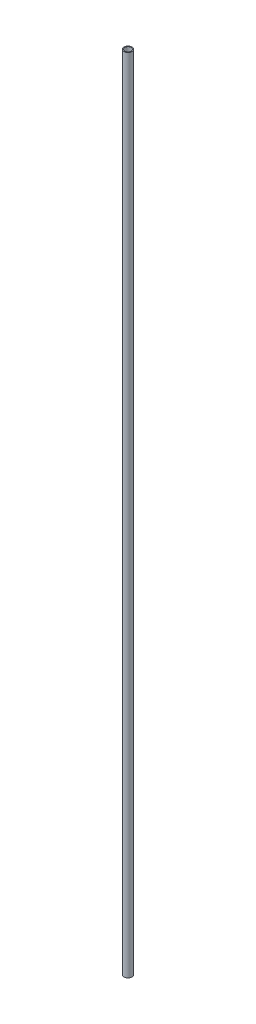
ISO-10303-21;
HEADER;
FILE_DESCRIPTION(('STEP AP214'),'2;1');
FILE_NAME('part.step','',(''),(''),'','','');
FILE_SCHEMA(('AUTOMOTIVE_DESIGN { 1 0 10303 214 1 1 1 1 }'));
ENDSEC;
DATA;
#1=APPLICATION_CONTEXT('core data for automotive mechanical design processes');
#2=APPLICATION_PROTOCOL_DEFINITION('international standard','automotive_design',2000,#1);
#3=PRODUCT_CONTEXT('',#1,'mechanical');
#4=PRODUCT('Part','Part','',(#3));
#5=PRODUCT_RELATED_PRODUCT_CATEGORY('part','',(#4));
#6=PRODUCT_DEFINITION_FORMATION('','',#4);
#7=PRODUCT_DEFINITION_CONTEXT('part definition',#1,'design');
#8=PRODUCT_DEFINITION('design','',#6,#7);
#9=PRODUCT_DEFINITION_SHAPE('','',#8);
#10=(LENGTH_UNIT() NAMED_UNIT(*) SI_UNIT(.MILLI.,.METRE.));
#11=(NAMED_UNIT(*) PLANE_ANGLE_UNIT() SI_UNIT($,.RADIAN.));
#12=(NAMED_UNIT(*) SI_UNIT($,.STERADIAN.) SOLID_ANGLE_UNIT());
#13=UNCERTAINTY_MEASURE_WITH_UNIT(LENGTH_MEASURE(1.E-05),#10,'distance_accuracy_value','');
#14=(GEOMETRIC_REPRESENTATION_CONTEXT(3) GLOBAL_UNCERTAINTY_ASSIGNED_CONTEXT((#13)) GLOBAL_UNIT_ASSIGNED_CONTEXT((#10,
#11,#12)) REPRESENTATION_CONTEXT('',''));
#15=CARTESIAN_POINT('',(0.,0.,0.));
#16=DIRECTION('',(0.,0.,1.));
#17=DIRECTION('',(1.,0.,0.));
#18=AXIS2_PLACEMENT_3D('',#15,#16,#17);
#19=CARTESIAN_POINT('',(0.,-1000.,0.));
#20=DIRECTION('',(0.,1.,0.));
#21=DIRECTION('',(0.,0.,1.));
#22=AXIS2_PLACEMENT_3D('',#19,#20,#21);
#23=CYLINDRICAL_SURFACE('',#22,5.);
#24=CARTESIAN_POINT('',(0.,-1000.,0.));
#25=DIRECTION('',(0.,1.,0.));
#26=DIRECTION('',(0.,0.,1.));
#27=AXIS2_PLACEMENT_3D('',#24,#25,#26);
#28=CIRCLE('',#27,5.);
#29=CARTESIAN_POINT('',(0.,-1000.,5.00000000000008));
#30=VERTEX_POINT('',#29);
#31=EDGE_CURVE('E12',#30,#30,#28,.T.);
#32=ORIENTED_EDGE('',*,*,#31,.T.);
#33=EDGE_LOOP('',(#32));
#34=FACE_BOUND('',#33,.T.);
#35=CARTESIAN_POINT('',(0.,0.,0.));
#36=DIRECTION('',(0.,1.,0.));
#37=DIRECTION('',(0.,0.,1.));
#38=AXIS2_PLACEMENT_3D('',#35,#36,#37);
#39=CIRCLE('',#38,5.);
#40=CARTESIAN_POINT('',(0.,0.,5.));
#41=VERTEX_POINT('',#40);
#42=EDGE_CURVE('E56',#41,#41,#39,.T.);
#43=ORIENTED_EDGE('',*,*,#42,.F.);
#44=EDGE_LOOP('',(#43));
#45=FACE_BOUND('',#44,.T.);
#46=ADVANCED_FACE('F53',(#34,#45),#23,.T.);
#47=CARTESIAN_POINT('',(0.,-1000.,0.));
#48=DIRECTION('',(0.,1.,0.));
#49=DIRECTION('',(0.,0.,1.));
#50=AXIS2_PLACEMENT_3D('',#47,#48,#49);
#51=PLANE('',#50);
#52=CARTESIAN_POINT('',(0.,-1000.,0.));
#53=DIRECTION('',(0.,1.,0.));
#54=DIRECTION('',(0.,0.,1.));
#55=AXIS2_PLACEMENT_3D('',#52,#53,#54);
#56=CIRCLE('',#55,4.);
#57=CARTESIAN_POINT('',(0.,-1000.,4.00000000000008));
#58=VERTEX_POINT('',#57);
#59=EDGE_CURVE('E63',#58,#58,#56,.T.);
#60=ORIENTED_EDGE('',*,*,#59,.T.);
#61=EDGE_LOOP('',(#60));
#62=FACE_BOUND('',#61,.T.);
#63=ORIENTED_EDGE('',*,*,#31,.F.);
#64=EDGE_LOOP('',(#63));
#65=FACE_BOUND('',#64,.T.);
#66=ADVANCED_FACE('F71',(#62,#65),#51,.F.);
#67=CARTESIAN_POINT('',(0.,0.,0.));
#68=DIRECTION('',(0.,1.,0.));
#69=DIRECTION('',(0.,0.,1.));
#70=AXIS2_PLACEMENT_3D('',#67,#68,#69);
#71=PLANE('',#70);
#72=CARTESIAN_POINT('',(0.,0.,0.));
#73=DIRECTION('',(0.,1.,0.));
#74=DIRECTION('',(0.,0.,1.));
#75=AXIS2_PLACEMENT_3D('',#72,#73,#74);
#76=CIRCLE('',#75,4.);
#77=CARTESIAN_POINT('',(0.,0.,4.));
#78=VERTEX_POINT('',#77);
#79=EDGE_CURVE('E65',#78,#78,#76,.T.);
#80=ORIENTED_EDGE('',*,*,#79,.F.);
#81=EDGE_LOOP('',(#80));
#82=FACE_BOUND('',#81,.T.);
#83=ORIENTED_EDGE('',*,*,#42,.T.);
#84=EDGE_LOOP('',(#83));
#85=FACE_BOUND('',#84,.T.);
#86=ADVANCED_FACE('F77',(#82,#85),#71,.T.);
#87=CARTESIAN_POINT('',(0.,-1000.,0.));
#88=DIRECTION('',(0.,1.,0.));
#89=DIRECTION('',(0.,0.,1.));
#90=AXIS2_PLACEMENT_3D('',#87,#88,#89);
#91=CYLINDRICAL_SURFACE('',#90,4.);
#92=ORIENTED_EDGE('',*,*,#59,.F.);
#93=EDGE_LOOP('',(#92));
#94=FACE_BOUND('',#93,.T.);
#95=ORIENTED_EDGE('',*,*,#79,.T.);
#96=EDGE_LOOP('',(#95));
#97=FACE_BOUND('',#96,.T.);
#98=ADVANCED_FACE('F74',(#94,#97),#91,.F.);
#99=CLOSED_SHELL('',(#46,#66,#86,#98));
#100=MANIFOLD_SOLID_BREP('B2',#99);
#101=ADVANCED_BREP_SHAPE_REPRESENTATION('',(#18,#100),#14);
#102=SHAPE_DEFINITION_REPRESENTATION(#9,#101);
ENDSEC;
END-ISO-10303-21;
